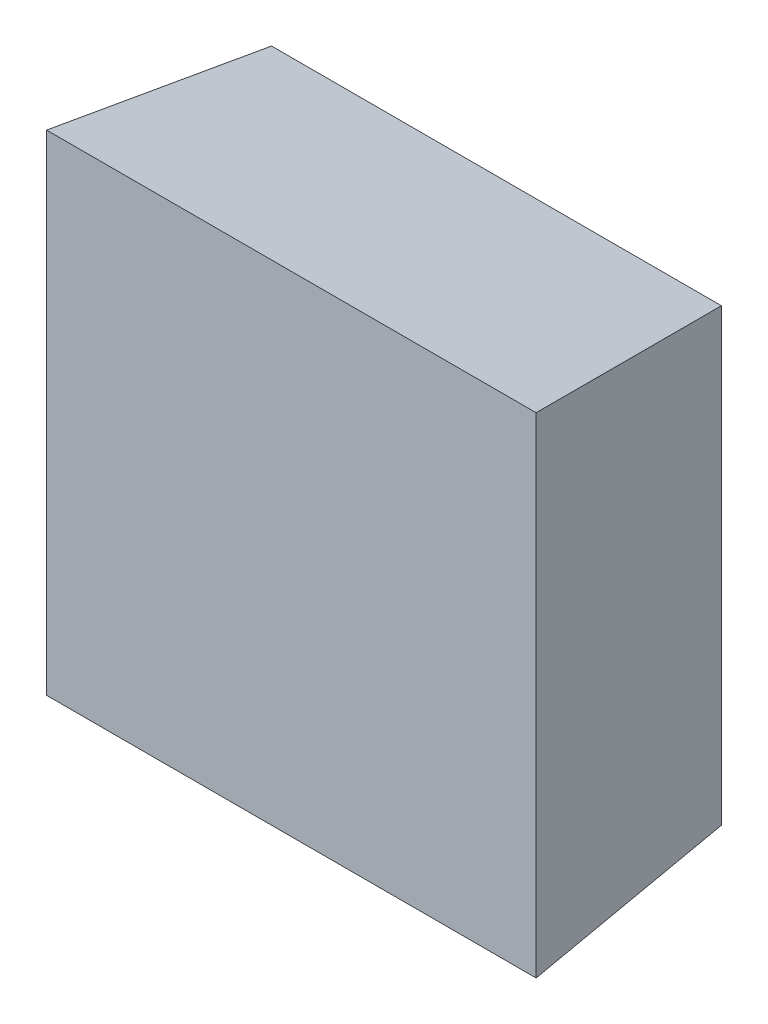
ISO-10303-21;
HEADER;
FILE_DESCRIPTION(('STEP AP214'),'2;1');
FILE_NAME('part.step','',(''),(''),'','','');
FILE_SCHEMA(('AUTOMOTIVE_DESIGN { 1 0 10303 214 1 1 1 1 }'));
ENDSEC;
DATA;
#1=APPLICATION_CONTEXT('core data for automotive mechanical design processes');
#2=APPLICATION_PROTOCOL_DEFINITION('international standard','automotive_design',2000,#1);
#3=PRODUCT_CONTEXT('',#1,'mechanical');
#4=PRODUCT('Part','Part','',(#3));
#5=PRODUCT_RELATED_PRODUCT_CATEGORY('part','',(#4));
#6=PRODUCT_DEFINITION_FORMATION('','',#4);
#7=PRODUCT_DEFINITION_CONTEXT('part definition',#1,'design');
#8=PRODUCT_DEFINITION('design','',#6,#7);
#9=PRODUCT_DEFINITION_SHAPE('','',#8);
#10=(LENGTH_UNIT() NAMED_UNIT(*) SI_UNIT(.MILLI.,.METRE.));
#11=(NAMED_UNIT(*) PLANE_ANGLE_UNIT() SI_UNIT($,.RADIAN.));
#12=(NAMED_UNIT(*) SI_UNIT($,.STERADIAN.) SOLID_ANGLE_UNIT());
#13=UNCERTAINTY_MEASURE_WITH_UNIT(LENGTH_MEASURE(1.E-05),#10,'distance_accuracy_value','');
#14=(GEOMETRIC_REPRESENTATION_CONTEXT(3) GLOBAL_UNCERTAINTY_ASSIGNED_CONTEXT((#13)) GLOBAL_UNIT_ASSIGNED_CONTEXT((#10,
#11,#12)) REPRESENTATION_CONTEXT('',''));
#15=CARTESIAN_POINT('',(0.,0.,0.));
#16=DIRECTION('',(0.,0.,1.));
#17=DIRECTION('',(1.,0.,0.));
#18=AXIS2_PLACEMENT_3D('',#15,#16,#17);
#19=CARTESIAN_POINT('',(0.,0.,20.));
#20=DIRECTION('',(1.,0.,0.));
#21=DIRECTION('',(0.,0.,-1.));
#22=AXIS2_PLACEMENT_3D('',#19,#20,#21);
#23=PLANE('',#22);
#24=DIRECTION('',(0.,-1.,0.));
#25=VECTOR('',#24,1.);
#26=CARTESIAN_POINT('',(0.,0.,0.));
#27=LINE('',#26,#25);
#28=CARTESIAN_POINT('',(0.,40.,0.));
#29=VERTEX_POINT('',#28);
#30=CARTESIAN_POINT('',(0.,0.,0.));
#31=VERTEX_POINT('',#30);
#32=EDGE_CURVE('E91',#29,#31,#27,.T.);
#33=ORIENTED_EDGE('',*,*,#32,.T.);
#34=DIRECTION('',(0.,0.,-1.));
#35=VECTOR('',#34,1.);
#36=CARTESIAN_POINT('',(0.,0.,20.));
#37=LINE('',#36,#35);
#38=CARTESIAN_POINT('',(0.,0.,20.));
#39=VERTEX_POINT('',#38);
#40=EDGE_CURVE('E11',#39,#31,#37,.T.);
#41=ORIENTED_EDGE('',*,*,#40,.F.);
#42=DIRECTION('',(0.,-1.,0.));
#43=VECTOR('',#42,1.);
#44=CARTESIAN_POINT('',(0.,0.,20.));
#45=LINE('',#44,#43);
#46=CARTESIAN_POINT('',(0.,43.5265396141693,20.));
#47=VERTEX_POINT('',#46);
#48=EDGE_CURVE('E82',#47,#39,#45,.T.);
#49=ORIENTED_EDGE('',*,*,#48,.F.);
#50=DIRECTION('',(0.,0.17364817766693,0.984807753012208));
#51=VECTOR('',#50,1.);
#52=CARTESIAN_POINT('',(0.,42.2140538489749,12.5565233413457));
#53=LINE('',#52,#51);
#54=EDGE_CURVE('E39',#47,#29,#53,.F.);
#55=ORIENTED_EDGE('',*,*,#54,.T.);
#56=EDGE_LOOP('',(#33,#41,#49,#55));
#57=FACE_BOUND('',#56,.T.);
#58=ADVANCED_FACE('F35',(#57),#23,.F.);
#59=CARTESIAN_POINT('',(0.,0.,20.));
#60=DIRECTION('',(0.,1.,0.));
#61=DIRECTION('',(0.,0.,1.));
#62=AXIS2_PLACEMENT_3D('',#59,#60,#61);
#63=PLANE('',#62);
#64=DIRECTION('',(1.,0.,0.));
#65=VECTOR('',#64,1.);
#66=CARTESIAN_POINT('',(0.,0.,0.));
#67=LINE('',#66,#65);
#68=CARTESIAN_POINT('',(40.,0.,0.));
#69=VERTEX_POINT('',#68);
#70=EDGE_CURVE('E94',#31,#69,#67,.T.);
#71=ORIENTED_EDGE('',*,*,#70,.T.);
#72=DIRECTION('',(0.17364817766693,0.,0.984807753012208));
#73=VECTOR('',#72,1.);
#74=CARTESIAN_POINT('',(40.,0.,0.));
#75=LINE('',#74,#73);
#76=CARTESIAN_POINT('',(43.5265396141693,0.,20.));
#77=VERTEX_POINT('',#76);
#78=EDGE_CURVE('E44',#77,#69,#75,.F.);
#79=ORIENTED_EDGE('',*,*,#78,.F.);
#80=DIRECTION('',(1.,0.,0.));
#81=VECTOR('',#80,1.);
#82=CARTESIAN_POINT('',(0.,0.,20.));
#83=LINE('',#82,#81);
#84=EDGE_CURVE('E77',#39,#77,#83,.T.);
#85=ORIENTED_EDGE('',*,*,#84,.F.);
#86=ORIENTED_EDGE('',*,*,#40,.T.);
#87=EDGE_LOOP('',(#71,#79,#85,#86));
#88=FACE_BOUND('',#87,.T.);
#89=ADVANCED_FACE('F78',(#88),#63,.F.);
#90=CARTESIAN_POINT('',(40.,0.,0.));
#91=DIRECTION('',(0.984807753012208,0.,-0.17364817766693));
#92=DIRECTION('',(-0.17364817766693,0.,-0.984807753012208));
#93=AXIS2_PLACEMENT_3D('',#90,#91,#92);
#94=PLANE('',#93);
#95=DIRECTION('',(0.,1.,0.));
#96=VECTOR('',#95,1.);
#97=CARTESIAN_POINT('',(40.,0.,0.));
#98=LINE('',#97,#96);
#99=CARTESIAN_POINT('',(40.,40.,0.));
#100=VERTEX_POINT('',#99);
#101=EDGE_CURVE('E96',#69,#100,#98,.T.);
#102=ORIENTED_EDGE('',*,*,#101,.T.);
#103=DIRECTION('',(-0.171087869746036,-0.171087869746036,-0.970287525247814));
#104=VECTOR('',#103,1.);
#105=CARTESIAN_POINT('',(38.8291576330305,38.8291576330305,-6.64017702943204));
#106=LINE('',#105,#104);
#107=CARTESIAN_POINT('',(43.5265396141693,43.5265396141693,20.));
#108=VERTEX_POINT('',#107);
#109=EDGE_CURVE('E101',#108,#100,#106,.T.);
#110=ORIENTED_EDGE('',*,*,#109,.F.);
#111=DIRECTION('',(0.,-1.,0.));
#112=VECTOR('',#111,1.);
#113=CARTESIAN_POINT('',(43.5265396141693,0.,20.));
#114=LINE('',#113,#112);
#115=EDGE_CURVE('E57',#77,#108,#114,.F.);
#116=ORIENTED_EDGE('',*,*,#115,.F.);
#117=ORIENTED_EDGE('',*,*,#78,.T.);
#118=EDGE_LOOP('',(#102,#110,#116,#117));
#119=FACE_BOUND('',#118,.T.);
#120=ADVANCED_FACE('F37',(#119),#94,.T.);
#121=CARTESIAN_POINT('',(0.,40.,0.));
#122=DIRECTION('',(0.,0.984807753012208,-0.17364817766693));
#123=DIRECTION('',(0.,0.17364817766693,0.984807753012208));
#124=AXIS2_PLACEMENT_3D('',#121,#122,#123);
#125=PLANE('',#124);
#126=DIRECTION('',(-1.,0.,0.));
#127=VECTOR('',#126,1.);
#128=CARTESIAN_POINT('',(0.,40.,0.));
#129=LINE('',#128,#127);
#130=EDGE_CURVE('E88',#100,#29,#129,.T.);
#131=ORIENTED_EDGE('',*,*,#130,.T.);
#132=ORIENTED_EDGE('',*,*,#54,.F.);
#133=DIRECTION('',(1.,0.,0.));
#134=VECTOR('',#133,1.);
#135=CARTESIAN_POINT('',(0.,43.5265396141693,20.));
#136=LINE('',#135,#134);
#137=EDGE_CURVE('E52',#108,#47,#136,.F.);
#138=ORIENTED_EDGE('',*,*,#137,.F.);
#139=ORIENTED_EDGE('',*,*,#109,.T.);
#140=EDGE_LOOP('',(#131,#132,#138,#139));
#141=FACE_BOUND('',#140,.T.);
#142=ADVANCED_FACE('F109',(#141),#125,.T.);
#143=CARTESIAN_POINT('',(0.,0.,20.));
#144=DIRECTION('',(0.,0.,-1.));
#145=DIRECTION('',(-1.,0.,0.));
#146=AXIS2_PLACEMENT_3D('',#143,#144,#145);
#147=PLANE('',#146);
#148=ORIENTED_EDGE('',*,*,#48,.T.);
#149=ORIENTED_EDGE('',*,*,#84,.T.);
#150=ORIENTED_EDGE('',*,*,#115,.T.);
#151=ORIENTED_EDGE('',*,*,#137,.T.);
#152=EDGE_LOOP('',(#148,#149,#150,#151));
#153=FACE_BOUND('',#152,.T.);
#154=ADVANCED_FACE('F85',(#153),#147,.F.);
#155=CARTESIAN_POINT('',(0.,0.,0.));
#156=DIRECTION('',(0.,0.,-1.));
#157=DIRECTION('',(-1.,0.,0.));
#158=AXIS2_PLACEMENT_3D('',#155,#156,#157);
#159=PLANE('',#158);
#160=ORIENTED_EDGE('',*,*,#32,.F.);
#161=ORIENTED_EDGE('',*,*,#130,.F.);
#162=ORIENTED_EDGE('',*,*,#101,.F.);
#163=ORIENTED_EDGE('',*,*,#70,.F.);
#164=EDGE_LOOP('',(#160,#161,#162,#163));
#165=FACE_BOUND('',#164,.T.);
#166=ADVANCED_FACE('F107',(#165),#159,.T.);
#167=CLOSED_SHELL('',(#58,#89,#120,#142,#154,#166));
#168=MANIFOLD_SOLID_BREP('B2',#167);
#169=ADVANCED_BREP_SHAPE_REPRESENTATION('',(#18,#168),#14);
#170=SHAPE_DEFINITION_REPRESENTATION(#9,#169);
ENDSEC;
END-ISO-10303-21;
